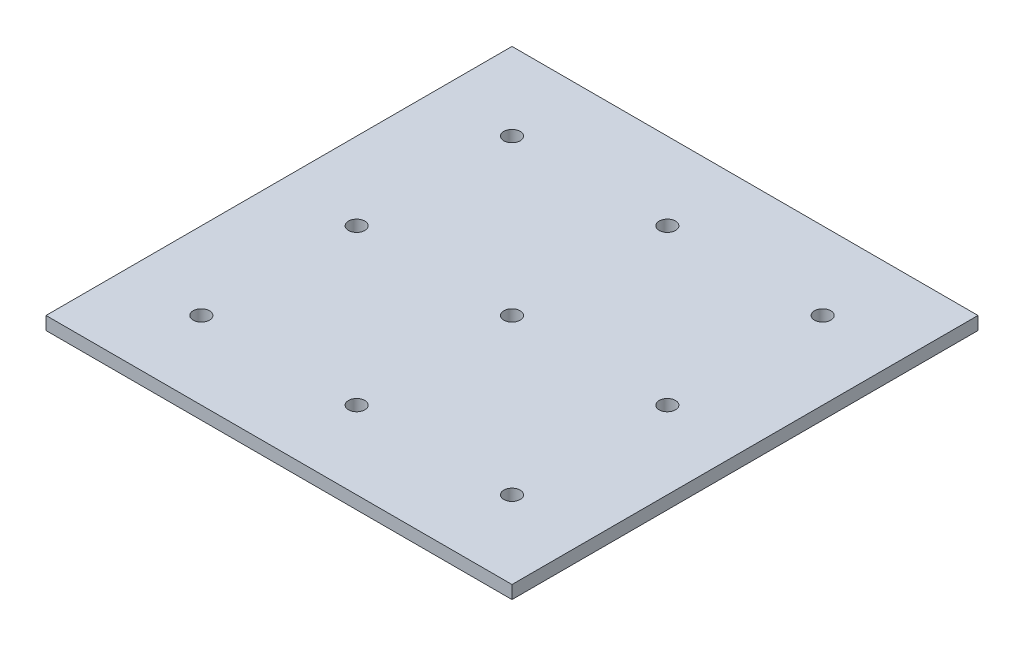
ISO-10303-21;
HEADER;
FILE_DESCRIPTION(('STEP AP214'),'2;1');
FILE_NAME('part.step','',(''),(''),'','','');
FILE_SCHEMA(('AUTOMOTIVE_DESIGN { 1 0 10303 214 1 1 1 1 }'));
ENDSEC;
DATA;
#1=APPLICATION_CONTEXT('core data for automotive mechanical design processes');
#2=APPLICATION_PROTOCOL_DEFINITION('international standard','automotive_design',2000,#1);
#3=PRODUCT_CONTEXT('',#1,'mechanical');
#4=PRODUCT('Part','Part','',(#3));
#5=PRODUCT_RELATED_PRODUCT_CATEGORY('part','',(#4));
#6=PRODUCT_DEFINITION_FORMATION('','',#4);
#7=PRODUCT_DEFINITION_CONTEXT('part definition',#1,'design');
#8=PRODUCT_DEFINITION('design','',#6,#7);
#9=PRODUCT_DEFINITION_SHAPE('','',#8);
#10=(LENGTH_UNIT() NAMED_UNIT(*) SI_UNIT(.MILLI.,.METRE.));
#11=(NAMED_UNIT(*) PLANE_ANGLE_UNIT() SI_UNIT($,.RADIAN.));
#12=(NAMED_UNIT(*) SI_UNIT($,.STERADIAN.) SOLID_ANGLE_UNIT());
#13=UNCERTAINTY_MEASURE_WITH_UNIT(LENGTH_MEASURE(1.E-05),#10,'distance_accuracy_value','');
#14=(GEOMETRIC_REPRESENTATION_CONTEXT(3) GLOBAL_UNCERTAINTY_ASSIGNED_CONTEXT((#13)) GLOBAL_UNIT_ASSIGNED_CONTEXT((#10,
#11,#12)) REPRESENTATION_CONTEXT('',''));
#15=CARTESIAN_POINT('',(0.,0.,0.));
#16=DIRECTION('',(0.,0.,1.));
#17=DIRECTION('',(1.,0.,0.));
#18=AXIS2_PLACEMENT_3D('',#15,#16,#17);
#19=CARTESIAN_POINT('',(-28.5,1.6,0.));
#20=DIRECTION('',(-1.,0.,0.));
#21=DIRECTION('',(0.,0.,1.));
#22=AXIS2_PLACEMENT_3D('',#19,#20,#21);
#23=PLANE('',#22);
#24=DIRECTION('',(0.,0.,-1.));
#25=VECTOR('',#24,1.);
#26=CARTESIAN_POINT('',(-28.5,0.,0.));
#27=LINE('',#26,#25);
#28=CARTESIAN_POINT('',(-28.5,0.,28.5));
#29=VERTEX_POINT('',#28);
#30=CARTESIAN_POINT('',(-28.5,0.,-28.5));
#31=VERTEX_POINT('',#30);
#32=EDGE_CURVE('E132',#29,#31,#27,.T.);
#33=ORIENTED_EDGE('',*,*,#32,.F.);
#34=DIRECTION('',(0.,-1.,0.));
#35=VECTOR('',#34,1.);
#36=CARTESIAN_POINT('',(-28.5,1.6,28.5));
#37=LINE('',#36,#35);
#38=CARTESIAN_POINT('',(-28.5,1.6,28.5));
#39=VERTEX_POINT('',#38);
#40=EDGE_CURVE('E11',#39,#29,#37,.T.);
#41=ORIENTED_EDGE('',*,*,#40,.F.);
#42=DIRECTION('',(0.,0.,-1.));
#43=VECTOR('',#42,1.);
#44=CARTESIAN_POINT('',(-28.5,1.6,0.));
#45=LINE('',#44,#43);
#46=CARTESIAN_POINT('',(-28.5,1.6,-28.5));
#47=VERTEX_POINT('',#46);
#48=EDGE_CURVE('E98',#39,#47,#45,.T.);
#49=ORIENTED_EDGE('',*,*,#48,.T.);
#50=DIRECTION('',(0.,-1.,0.));
#51=VECTOR('',#50,1.);
#52=CARTESIAN_POINT('',(-28.5,1.6,-28.5));
#53=LINE('',#52,#51);
#54=EDGE_CURVE('E77',#47,#31,#53,.T.);
#55=ORIENTED_EDGE('',*,*,#54,.T.);
#56=EDGE_LOOP('',(#33,#41,#49,#55));
#57=FACE_BOUND('',#56,.T.);
#58=ADVANCED_FACE('F37',(#57),#23,.T.);
#59=CARTESIAN_POINT('',(0.,1.6,28.5));
#60=DIRECTION('',(0.,0.,1.));
#61=DIRECTION('',(1.,0.,0.));
#62=AXIS2_PLACEMENT_3D('',#59,#60,#61);
#63=PLANE('',#62);
#64=DIRECTION('',(-1.,0.,0.));
#65=VECTOR('',#64,1.);
#66=CARTESIAN_POINT('',(0.,0.,28.5));
#67=LINE('',#66,#65);
#68=CARTESIAN_POINT('',(28.5,0.,28.5));
#69=VERTEX_POINT('',#68);
#70=EDGE_CURVE('E89',#69,#29,#67,.T.);
#71=ORIENTED_EDGE('',*,*,#70,.F.);
#72=DIRECTION('',(0.,-1.,0.));
#73=VECTOR('',#72,1.);
#74=CARTESIAN_POINT('',(28.5,1.6,28.5));
#75=LINE('',#74,#73);
#76=CARTESIAN_POINT('',(28.5,1.6,28.5));
#77=VERTEX_POINT('',#76);
#78=EDGE_CURVE('E46',#77,#69,#75,.T.);
#79=ORIENTED_EDGE('',*,*,#78,.F.);
#80=DIRECTION('',(-1.,0.,0.));
#81=VECTOR('',#80,1.);
#82=CARTESIAN_POINT('',(0.,1.6,28.5));
#83=LINE('',#82,#81);
#84=EDGE_CURVE('E87',#77,#39,#83,.T.);
#85=ORIENTED_EDGE('',*,*,#84,.T.);
#86=ORIENTED_EDGE('',*,*,#40,.T.);
#87=EDGE_LOOP('',(#71,#79,#85,#86));
#88=FACE_BOUND('',#87,.T.);
#89=ADVANCED_FACE('F85',(#88),#63,.T.);
#90=CARTESIAN_POINT('',(28.5,1.6,0.));
#91=DIRECTION('',(-1.,0.,0.));
#92=DIRECTION('',(0.,0.,1.));
#93=AXIS2_PLACEMENT_3D('',#90,#91,#92);
#94=PLANE('',#93);
#95=DIRECTION('',(0.,0.,-1.));
#96=VECTOR('',#95,1.);
#97=CARTESIAN_POINT('',(28.5,0.,0.));
#98=LINE('',#97,#96);
#99=CARTESIAN_POINT('',(28.5,0.,-28.5));
#100=VERTEX_POINT('',#99);
#101=EDGE_CURVE('E135',#69,#100,#98,.T.);
#102=ORIENTED_EDGE('',*,*,#101,.T.);
#103=DIRECTION('',(0.,-1.,0.));
#104=VECTOR('',#103,1.);
#105=CARTESIAN_POINT('',(28.5,1.6,-28.5));
#106=LINE('',#105,#104);
#107=CARTESIAN_POINT('',(28.5,1.6,-28.5));
#108=VERTEX_POINT('',#107);
#109=EDGE_CURVE('E92',#108,#100,#106,.T.);
#110=ORIENTED_EDGE('',*,*,#109,.F.);
#111=DIRECTION('',(0.,0.,-1.));
#112=VECTOR('',#111,1.);
#113=CARTESIAN_POINT('',(28.5,1.6,0.));
#114=LINE('',#113,#112);
#115=EDGE_CURVE('E94',#77,#108,#114,.T.);
#116=ORIENTED_EDGE('',*,*,#115,.F.);
#117=ORIENTED_EDGE('',*,*,#78,.T.);
#118=EDGE_LOOP('',(#102,#110,#116,#117));
#119=FACE_BOUND('',#118,.T.);
#120=ADVANCED_FACE('F95',(#119),#94,.F.);
#121=CARTESIAN_POINT('',(0.,1.6,0.));
#122=DIRECTION('',(0.,-1.,0.));
#123=DIRECTION('',(0.,0.,-1.));
#124=AXIS2_PLACEMENT_3D('',#121,#122,#123);
#125=CYLINDRICAL_SURFACE('',#124,1.);
#126=CARTESIAN_POINT('',(0.,1.6,0.));
#127=DIRECTION('',(0.,1.,0.));
#128=DIRECTION('',(0.,0.,1.));
#129=AXIS2_PLACEMENT_3D('',#126,#127,#128);
#130=CIRCLE('',#129,1.);
#131=CARTESIAN_POINT('',(0.,1.6,1.));
#132=VERTEX_POINT('',#131);
#133=EDGE_CURVE('E100',#132,#132,#130,.T.);
#134=ORIENTED_EDGE('',*,*,#133,.T.);
#135=EDGE_LOOP('',(#134));
#136=FACE_BOUND('',#135,.T.);
#137=CARTESIAN_POINT('',(0.,0.,0.));
#138=DIRECTION('',(0.,1.,0.));
#139=DIRECTION('',(0.,0.,1.));
#140=AXIS2_PLACEMENT_3D('',#137,#138,#139);
#141=CIRCLE('',#140,1.);
#142=CARTESIAN_POINT('',(0.,0.,1.));
#143=VERTEX_POINT('',#142);
#144=EDGE_CURVE('E129',#143,#143,#141,.T.);
#145=ORIENTED_EDGE('',*,*,#144,.F.);
#146=EDGE_LOOP('',(#145));
#147=FACE_BOUND('',#146,.T.);
#148=ADVANCED_FACE('F151',(#136,#147),#125,.F.);
#149=CARTESIAN_POINT('',(-19.,1.6,0.));
#150=DIRECTION('',(0.,-1.,0.));
#151=DIRECTION('',(0.,0.,-1.));
#152=AXIS2_PLACEMENT_3D('',#149,#150,#151);
#153=CYLINDRICAL_SURFACE('',#152,1.);
#154=CARTESIAN_POINT('',(-19.,1.6,0.));
#155=DIRECTION('',(0.,1.,0.));
#156=DIRECTION('',(0.,0.,1.));
#157=AXIS2_PLACEMENT_3D('',#154,#155,#156);
#158=CIRCLE('',#157,1.);
#159=CARTESIAN_POINT('',(-19.,1.6,1.));
#160=VERTEX_POINT('',#159);
#161=EDGE_CURVE('E375',#160,#160,#158,.T.);
#162=ORIENTED_EDGE('',*,*,#161,.T.);
#163=EDGE_LOOP('',(#162));
#164=FACE_BOUND('',#163,.T.);
#165=CARTESIAN_POINT('',(-19.,0.,0.));
#166=DIRECTION('',(0.,1.,0.));
#167=DIRECTION('',(0.,0.,1.));
#168=AXIS2_PLACEMENT_3D('',#165,#166,#167);
#169=CIRCLE('',#168,1.);
#170=CARTESIAN_POINT('',(-19.,0.,1.));
#171=VERTEX_POINT('',#170);
#172=EDGE_CURVE('E126',#171,#171,#169,.T.);
#173=ORIENTED_EDGE('',*,*,#172,.F.);
#174=EDGE_LOOP('',(#173));
#175=FACE_BOUND('',#174,.T.);
#176=ADVANCED_FACE('F154',(#164,#175),#153,.F.);
#177=CARTESIAN_POINT('',(19.,1.6,0.));
#178=DIRECTION('',(0.,-1.,0.));
#179=DIRECTION('',(0.,0.,-1.));
#180=AXIS2_PLACEMENT_3D('',#177,#178,#179);
#181=CYLINDRICAL_SURFACE('',#180,1.);
#182=CARTESIAN_POINT('',(19.,1.6,0.));
#183=DIRECTION('',(0.,1.,0.));
#184=DIRECTION('',(0.,0.,1.));
#185=AXIS2_PLACEMENT_3D('',#182,#183,#184);
#186=CIRCLE('',#185,1.);
#187=CARTESIAN_POINT('',(19.,1.6,1.));
#188=VERTEX_POINT('',#187);
#189=EDGE_CURVE('E371',#188,#188,#186,.T.);
#190=ORIENTED_EDGE('',*,*,#189,.T.);
#191=EDGE_LOOP('',(#190));
#192=FACE_BOUND('',#191,.T.);
#193=CARTESIAN_POINT('',(19.,0.,0.));
#194=DIRECTION('',(0.,1.,0.));
#195=DIRECTION('',(0.,0.,1.));
#196=AXIS2_PLACEMENT_3D('',#193,#194,#195);
#197=CIRCLE('',#196,1.);
#198=CARTESIAN_POINT('',(19.,0.,1.));
#199=VERTEX_POINT('',#198);
#200=EDGE_CURVE('E123',#199,#199,#197,.T.);
#201=ORIENTED_EDGE('',*,*,#200,.F.);
#202=EDGE_LOOP('',(#201));
#203=FACE_BOUND('',#202,.T.);
#204=ADVANCED_FACE('F158',(#192,#203),#181,.F.);
#205=CARTESIAN_POINT('',(-19.,1.6,-19.));
#206=DIRECTION('',(0.,-1.,0.));
#207=DIRECTION('',(0.,0.,-1.));
#208=AXIS2_PLACEMENT_3D('',#205,#206,#207);
#209=CYLINDRICAL_SURFACE('',#208,1.);
#210=CARTESIAN_POINT('',(-19.,1.6,-19.));
#211=DIRECTION('',(0.,1.,0.));
#212=DIRECTION('',(0.,0.,1.));
#213=AXIS2_PLACEMENT_3D('',#210,#211,#212);
#214=CIRCLE('',#213,1.);
#215=CARTESIAN_POINT('',(-19.,1.6,-18.));
#216=VERTEX_POINT('',#215);
#217=EDGE_CURVE('E367',#216,#216,#214,.T.);
#218=ORIENTED_EDGE('',*,*,#217,.T.);
#219=EDGE_LOOP('',(#218));
#220=FACE_BOUND('',#219,.T.);
#221=CARTESIAN_POINT('',(-19.,0.,-19.));
#222=DIRECTION('',(0.,1.,0.));
#223=DIRECTION('',(0.,0.,1.));
#224=AXIS2_PLACEMENT_3D('',#221,#222,#223);
#225=CIRCLE('',#224,1.);
#226=CARTESIAN_POINT('',(-19.,0.,-18.));
#227=VERTEX_POINT('',#226);
#228=EDGE_CURVE('E120',#227,#227,#225,.T.);
#229=ORIENTED_EDGE('',*,*,#228,.F.);
#230=EDGE_LOOP('',(#229));
#231=FACE_BOUND('',#230,.T.);
#232=ADVANCED_FACE('F162',(#220,#231),#209,.F.);
#233=CARTESIAN_POINT('',(19.,1.6,-19.));
#234=DIRECTION('',(0.,-1.,0.));
#235=DIRECTION('',(0.,0.,-1.));
#236=AXIS2_PLACEMENT_3D('',#233,#234,#235);
#237=CYLINDRICAL_SURFACE('',#236,1.);
#238=CARTESIAN_POINT('',(19.,1.6,-19.));
#239=DIRECTION('',(0.,1.,0.));
#240=DIRECTION('',(0.,0.,1.));
#241=AXIS2_PLACEMENT_3D('',#238,#239,#240);
#242=CIRCLE('',#241,1.);
#243=CARTESIAN_POINT('',(19.,1.6,-18.));
#244=VERTEX_POINT('',#243);
#245=EDGE_CURVE('E363',#244,#244,#242,.T.);
#246=ORIENTED_EDGE('',*,*,#245,.T.);
#247=EDGE_LOOP('',(#246));
#248=FACE_BOUND('',#247,.T.);
#249=CARTESIAN_POINT('',(19.,0.,-19.));
#250=DIRECTION('',(0.,1.,0.));
#251=DIRECTION('',(0.,0.,1.));
#252=AXIS2_PLACEMENT_3D('',#249,#250,#251);
#253=CIRCLE('',#252,1.);
#254=CARTESIAN_POINT('',(19.,0.,-18.));
#255=VERTEX_POINT('',#254);
#256=EDGE_CURVE('E117',#255,#255,#253,.T.);
#257=ORIENTED_EDGE('',*,*,#256,.F.);
#258=EDGE_LOOP('',(#257));
#259=FACE_BOUND('',#258,.T.);
#260=ADVANCED_FACE('F166',(#248,#259),#237,.F.);
#261=CARTESIAN_POINT('',(0.,1.6,-19.));
#262=DIRECTION('',(0.,-1.,0.));
#263=DIRECTION('',(0.,0.,-1.));
#264=AXIS2_PLACEMENT_3D('',#261,#262,#263);
#265=CYLINDRICAL_SURFACE('',#264,1.);
#266=CARTESIAN_POINT('',(0.,1.6,-19.));
#267=DIRECTION('',(0.,1.,0.));
#268=DIRECTION('',(0.,0.,1.));
#269=AXIS2_PLACEMENT_3D('',#266,#267,#268);
#270=CIRCLE('',#269,1.);
#271=CARTESIAN_POINT('',(0.,1.6,-18.));
#272=VERTEX_POINT('',#271);
#273=EDGE_CURVE('E359',#272,#272,#270,.T.);
#274=ORIENTED_EDGE('',*,*,#273,.T.);
#275=EDGE_LOOP('',(#274));
#276=FACE_BOUND('',#275,.T.);
#277=CARTESIAN_POINT('',(0.,0.,-19.));
#278=DIRECTION('',(0.,1.,0.));
#279=DIRECTION('',(0.,0.,1.));
#280=AXIS2_PLACEMENT_3D('',#277,#278,#279);
#281=CIRCLE('',#280,1.);
#282=CARTESIAN_POINT('',(0.,0.,-18.));
#283=VERTEX_POINT('',#282);
#284=EDGE_CURVE('E114',#283,#283,#281,.T.);
#285=ORIENTED_EDGE('',*,*,#284,.F.);
#286=EDGE_LOOP('',(#285));
#287=FACE_BOUND('',#286,.T.);
#288=ADVANCED_FACE('F170',(#276,#287),#265,.F.);
#289=CARTESIAN_POINT('',(-19.,1.6,19.));
#290=DIRECTION('',(0.,-1.,0.));
#291=DIRECTION('',(0.,0.,-1.));
#292=AXIS2_PLACEMENT_3D('',#289,#290,#291);
#293=CYLINDRICAL_SURFACE('',#292,1.);
#294=CARTESIAN_POINT('',(-19.,1.6,19.));
#295=DIRECTION('',(0.,1.,0.));
#296=DIRECTION('',(0.,0.,1.));
#297=AXIS2_PLACEMENT_3D('',#294,#295,#296);
#298=CIRCLE('',#297,1.);
#299=CARTESIAN_POINT('',(-19.,1.6,20.));
#300=VERTEX_POINT('',#299);
#301=EDGE_CURVE('E355',#300,#300,#298,.T.);
#302=ORIENTED_EDGE('',*,*,#301,.T.);
#303=EDGE_LOOP('',(#302));
#304=FACE_BOUND('',#303,.T.);
#305=CARTESIAN_POINT('',(-19.,0.,19.));
#306=DIRECTION('',(0.,1.,0.));
#307=DIRECTION('',(0.,0.,1.));
#308=AXIS2_PLACEMENT_3D('',#305,#306,#307);
#309=CIRCLE('',#308,1.);
#310=CARTESIAN_POINT('',(-19.,0.,20.));
#311=VERTEX_POINT('',#310);
#312=EDGE_CURVE('E111',#311,#311,#309,.T.);
#313=ORIENTED_EDGE('',*,*,#312,.F.);
#314=EDGE_LOOP('',(#313));
#315=FACE_BOUND('',#314,.T.);
#316=ADVANCED_FACE('F174',(#304,#315),#293,.F.);
#317=CARTESIAN_POINT('',(19.,1.6,19.));
#318=DIRECTION('',(0.,-1.,0.));
#319=DIRECTION('',(0.,0.,-1.));
#320=AXIS2_PLACEMENT_3D('',#317,#318,#319);
#321=CYLINDRICAL_SURFACE('',#320,1.);
#322=CARTESIAN_POINT('',(19.,1.6,19.));
#323=DIRECTION('',(0.,1.,0.));
#324=DIRECTION('',(0.,0.,1.));
#325=AXIS2_PLACEMENT_3D('',#322,#323,#324);
#326=CIRCLE('',#325,1.);
#327=CARTESIAN_POINT('',(19.,1.6,20.));
#328=VERTEX_POINT('',#327);
#329=EDGE_CURVE('E188',#328,#328,#326,.T.);
#330=ORIENTED_EDGE('',*,*,#329,.T.);
#331=EDGE_LOOP('',(#330));
#332=FACE_BOUND('',#331,.T.);
#333=CARTESIAN_POINT('',(19.,0.,19.));
#334=DIRECTION('',(0.,1.,0.));
#335=DIRECTION('',(0.,0.,1.));
#336=AXIS2_PLACEMENT_3D('',#333,#334,#335);
#337=CIRCLE('',#336,1.);
#338=CARTESIAN_POINT('',(19.,0.,20.));
#339=VERTEX_POINT('',#338);
#340=EDGE_CURVE('E108',#339,#339,#337,.T.);
#341=ORIENTED_EDGE('',*,*,#340,.F.);
#342=EDGE_LOOP('',(#341));
#343=FACE_BOUND('',#342,.T.);
#344=ADVANCED_FACE('F177',(#332,#343),#321,.F.);
#345=CARTESIAN_POINT('',(0.,1.6,19.));
#346=DIRECTION('',(0.,-1.,0.));
#347=DIRECTION('',(0.,0.,-1.));
#348=AXIS2_PLACEMENT_3D('',#345,#346,#347);
#349=CYLINDRICAL_SURFACE('',#348,1.);
#350=CARTESIAN_POINT('',(0.,1.6,19.));
#351=DIRECTION('',(0.,1.,0.));
#352=DIRECTION('',(0.,0.,1.));
#353=AXIS2_PLACEMENT_3D('',#350,#351,#352);
#354=CIRCLE('',#353,1.);
#355=CARTESIAN_POINT('',(0.,1.6,20.));
#356=VERTEX_POINT('',#355);
#357=EDGE_CURVE('E138',#356,#356,#354,.T.);
#358=ORIENTED_EDGE('',*,*,#357,.T.);
#359=EDGE_LOOP('',(#358));
#360=FACE_BOUND('',#359,.T.);
#361=CARTESIAN_POINT('',(0.,0.,19.));
#362=DIRECTION('',(0.,1.,0.));
#363=DIRECTION('',(0.,0.,1.));
#364=AXIS2_PLACEMENT_3D('',#361,#362,#363);
#365=CIRCLE('',#364,1.);
#366=CARTESIAN_POINT('',(0.,0.,20.));
#367=VERTEX_POINT('',#366);
#368=EDGE_CURVE('E105',#367,#367,#365,.T.);
#369=ORIENTED_EDGE('',*,*,#368,.F.);
#370=EDGE_LOOP('',(#369));
#371=FACE_BOUND('',#370,.T.);
#372=ADVANCED_FACE('F39',(#360,#371),#349,.F.);
#373=CARTESIAN_POINT('',(0.,1.6,-28.5));
#374=DIRECTION('',(0.,0.,1.));
#375=DIRECTION('',(1.,0.,0.));
#376=AXIS2_PLACEMENT_3D('',#373,#374,#375);
#377=PLANE('',#376);
#378=DIRECTION('',(-1.,0.,0.));
#379=VECTOR('',#378,1.);
#380=CARTESIAN_POINT('',(0.,0.,-28.5));
#381=LINE('',#380,#379);
#382=EDGE_CURVE('E70',#100,#31,#381,.T.);
#383=ORIENTED_EDGE('',*,*,#382,.T.);
#384=ORIENTED_EDGE('',*,*,#54,.F.);
#385=DIRECTION('',(-1.,0.,0.));
#386=VECTOR('',#385,1.);
#387=CARTESIAN_POINT('',(0.,1.6,-28.5));
#388=LINE('',#387,#386);
#389=EDGE_CURVE('E54',#108,#47,#388,.T.);
#390=ORIENTED_EDGE('',*,*,#389,.F.);
#391=ORIENTED_EDGE('',*,*,#109,.T.);
#392=EDGE_LOOP('',(#383,#384,#390,#391));
#393=FACE_BOUND('',#392,.T.);
#394=ADVANCED_FACE('F141',(#393),#377,.F.);
#395=CARTESIAN_POINT('',(0.,1.6,0.));
#396=DIRECTION('',(0.,1.,0.));
#397=DIRECTION('',(0.,0.,1.));
#398=AXIS2_PLACEMENT_3D('',#395,#396,#397);
#399=PLANE('',#398);
#400=ORIENTED_EDGE('',*,*,#357,.F.);
#401=EDGE_LOOP('',(#400));
#402=FACE_BOUND('',#401,.T.);
#403=ORIENTED_EDGE('',*,*,#329,.F.);
#404=EDGE_LOOP('',(#403));
#405=FACE_BOUND('',#404,.T.);
#406=ORIENTED_EDGE('',*,*,#301,.F.);
#407=EDGE_LOOP('',(#406));
#408=FACE_BOUND('',#407,.T.);
#409=ORIENTED_EDGE('',*,*,#273,.F.);
#410=EDGE_LOOP('',(#409));
#411=FACE_BOUND('',#410,.T.);
#412=ORIENTED_EDGE('',*,*,#245,.F.);
#413=EDGE_LOOP('',(#412));
#414=FACE_BOUND('',#413,.T.);
#415=ORIENTED_EDGE('',*,*,#217,.F.);
#416=EDGE_LOOP('',(#415));
#417=FACE_BOUND('',#416,.T.);
#418=ORIENTED_EDGE('',*,*,#189,.F.);
#419=EDGE_LOOP('',(#418));
#420=FACE_BOUND('',#419,.T.);
#421=ORIENTED_EDGE('',*,*,#161,.F.);
#422=EDGE_LOOP('',(#421));
#423=FACE_BOUND('',#422,.T.);
#424=ORIENTED_EDGE('',*,*,#133,.F.);
#425=EDGE_LOOP('',(#424));
#426=FACE_BOUND('',#425,.T.);
#427=ORIENTED_EDGE('',*,*,#48,.F.);
#428=ORIENTED_EDGE('',*,*,#84,.F.);
#429=ORIENTED_EDGE('',*,*,#115,.T.);
#430=ORIENTED_EDGE('',*,*,#389,.T.);
#431=EDGE_LOOP('',(#427,#428,#429,#430));
#432=FACE_BOUND('',#431,.T.);
#433=ADVANCED_FACE('F97',(#402,#405,#408,#411,#414,#417,#420,#423,#426,#432),#399,.T.);
#434=CARTESIAN_POINT('',(0.,0.,0.));
#435=DIRECTION('',(0.,1.,0.));
#436=DIRECTION('',(0.,0.,1.));
#437=AXIS2_PLACEMENT_3D('',#434,#435,#436);
#438=PLANE('',#437);
#439=ORIENTED_EDGE('',*,*,#368,.T.);
#440=EDGE_LOOP('',(#439));
#441=FACE_BOUND('',#440,.T.);
#442=ORIENTED_EDGE('',*,*,#340,.T.);
#443=EDGE_LOOP('',(#442));
#444=FACE_BOUND('',#443,.T.);
#445=ORIENTED_EDGE('',*,*,#312,.T.);
#446=EDGE_LOOP('',(#445));
#447=FACE_BOUND('',#446,.T.);
#448=ORIENTED_EDGE('',*,*,#284,.T.);
#449=EDGE_LOOP('',(#448));
#450=FACE_BOUND('',#449,.T.);
#451=ORIENTED_EDGE('',*,*,#256,.T.);
#452=EDGE_LOOP('',(#451));
#453=FACE_BOUND('',#452,.T.);
#454=ORIENTED_EDGE('',*,*,#228,.T.);
#455=EDGE_LOOP('',(#454));
#456=FACE_BOUND('',#455,.T.);
#457=ORIENTED_EDGE('',*,*,#200,.T.);
#458=EDGE_LOOP('',(#457));
#459=FACE_BOUND('',#458,.T.);
#460=ORIENTED_EDGE('',*,*,#172,.T.);
#461=EDGE_LOOP('',(#460));
#462=FACE_BOUND('',#461,.T.);
#463=ORIENTED_EDGE('',*,*,#144,.T.);
#464=EDGE_LOOP('',(#463));
#465=FACE_BOUND('',#464,.T.);
#466=ORIENTED_EDGE('',*,*,#32,.T.);
#467=ORIENTED_EDGE('',*,*,#382,.F.);
#468=ORIENTED_EDGE('',*,*,#101,.F.);
#469=ORIENTED_EDGE('',*,*,#70,.T.);
#470=EDGE_LOOP('',(#466,#467,#468,#469));
#471=FACE_BOUND('',#470,.T.);
#472=ADVANCED_FACE('F142',(#441,#444,#447,#450,#453,#456,#459,#462,#465,#471),#438,.F.);
#473=CLOSED_SHELL('',(#58,#89,#120,#148,#176,#204,#232,#260,#288,#316,#344,#372,#394,#433,#472));
#474=MANIFOLD_SOLID_BREP('B2',#473);
#475=ADVANCED_BREP_SHAPE_REPRESENTATION('',(#18,#474),#14);
#476=SHAPE_DEFINITION_REPRESENTATION(#9,#475);
ENDSEC;
END-ISO-10303-21;
